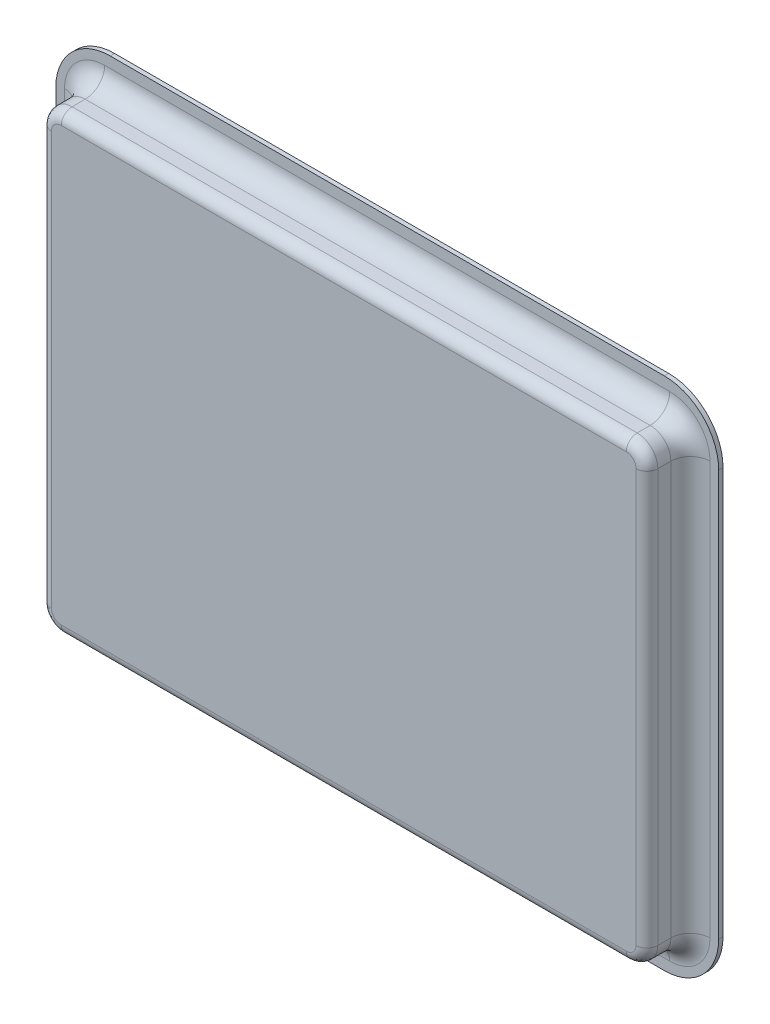
ISO-10303-21;
HEADER;
FILE_DESCRIPTION(('STEP AP214'),'2;1');
FILE_NAME('part.step','',(''),(''),'','','');
FILE_SCHEMA(('AUTOMOTIVE_DESIGN { 1 0 10303 214 1 1 1 1 }'));
ENDSEC;
DATA;
#1=APPLICATION_CONTEXT('core data for automotive mechanical design processes');
#2=APPLICATION_PROTOCOL_DEFINITION('international standard','automotive_design',2000,#1);
#3=PRODUCT_CONTEXT('',#1,'mechanical');
#4=PRODUCT('Part','Part','',(#3));
#5=PRODUCT_RELATED_PRODUCT_CATEGORY('part','',(#4));
#6=PRODUCT_DEFINITION_FORMATION('','',#4);
#7=PRODUCT_DEFINITION_CONTEXT('part definition',#1,'design');
#8=PRODUCT_DEFINITION('design','',#6,#7);
#9=PRODUCT_DEFINITION_SHAPE('','',#8);
#10=(LENGTH_UNIT() NAMED_UNIT(*) SI_UNIT(.MILLI.,.METRE.));
#11=(NAMED_UNIT(*) PLANE_ANGLE_UNIT() SI_UNIT($,.RADIAN.));
#12=(NAMED_UNIT(*) SI_UNIT($,.STERADIAN.) SOLID_ANGLE_UNIT());
#13=UNCERTAINTY_MEASURE_WITH_UNIT(LENGTH_MEASURE(1.E-05),#10,'distance_accuracy_value','');
#14=(GEOMETRIC_REPRESENTATION_CONTEXT(3) GLOBAL_UNCERTAINTY_ASSIGNED_CONTEXT((#13)) GLOBAL_UNIT_ASSIGNED_CONTEXT((#10,
#11,#12)) REPRESENTATION_CONTEXT('',''));
#15=CARTESIAN_POINT('',(0.,0.,0.));
#16=DIRECTION('',(0.,0.,1.));
#17=DIRECTION('',(1.,0.,0.));
#18=AXIS2_PLACEMENT_3D('',#15,#16,#17);
#19=CARTESIAN_POINT('',(0.,0.,0.));
#20=DIRECTION('',(0.,0.,1.));
#21=DIRECTION('',(1.,0.,0.));
#22=AXIS2_PLACEMENT_3D('',#19,#20,#21);
#23=PLANE('',#22);
#24=CARTESIAN_POINT('',(-1.275,0.935,0.));
#25=DIRECTION('',(0.,0.,1.));
#26=DIRECTION('',(1.,0.,0.));
#27=AXIS2_PLACEMENT_3D('',#24,#25,#26);
#28=CIRCLE('',#27,0.25);
#29=CARTESIAN_POINT('',(-1.275,1.185,0.));
#30=VERTEX_POINT('',#29);
#31=CARTESIAN_POINT('',(-1.525,0.935,0.));
#32=VERTEX_POINT('',#31);
#33=EDGE_CURVE('E223',#30,#32,#28,.T.);
#34=ORIENTED_EDGE('',*,*,#33,.F.);
#35=DIRECTION('',(1.,0.,0.));
#36=VECTOR('',#35,1.);
#37=CARTESIAN_POINT('',(-1.275,1.185,0.));
#38=LINE('',#37,#36);
#39=CARTESIAN_POINT('',(1.275,1.185,0.));
#40=VERTEX_POINT('',#39);
#41=EDGE_CURVE('E239',#30,#40,#38,.T.);
#42=ORIENTED_EDGE('',*,*,#41,.T.);
#43=CARTESIAN_POINT('',(1.275,0.935,0.));
#44=DIRECTION('',(0.,0.,1.));
#45=DIRECTION('',(1.,0.,0.));
#46=AXIS2_PLACEMENT_3D('',#43,#44,#45);
#47=CIRCLE('',#46,0.25);
#48=CARTESIAN_POINT('',(1.525,0.935,0.));
#49=VERTEX_POINT('',#48);
#50=EDGE_CURVE('E243',#49,#40,#47,.T.);
#51=ORIENTED_EDGE('',*,*,#50,.F.);
#52=DIRECTION('',(0.,-1.,0.));
#53=VECTOR('',#52,1.);
#54=CARTESIAN_POINT('',(1.525,0.935,0.));
#55=LINE('',#54,#53);
#56=CARTESIAN_POINT('',(1.525,-0.935,0.));
#57=VERTEX_POINT('',#56);
#58=EDGE_CURVE('E82',#49,#57,#55,.T.);
#59=ORIENTED_EDGE('',*,*,#58,.T.);
#60=CARTESIAN_POINT('',(1.275,-0.935,0.));
#61=DIRECTION('',(0.,0.,1.));
#62=DIRECTION('',(1.,0.,0.));
#63=AXIS2_PLACEMENT_3D('',#60,#61,#62);
#64=CIRCLE('',#63,0.25);
#65=CARTESIAN_POINT('',(1.275,-1.185,0.));
#66=VERTEX_POINT('',#65);
#67=EDGE_CURVE('E53',#66,#57,#64,.T.);
#68=ORIENTED_EDGE('',*,*,#67,.F.);
#69=DIRECTION('',(-1.,0.,0.));
#70=VECTOR('',#69,1.);
#71=CARTESIAN_POINT('',(1.275,-1.185,0.));
#72=LINE('',#71,#70);
#73=CARTESIAN_POINT('',(-1.275,-1.185,0.));
#74=VERTEX_POINT('',#73);
#75=EDGE_CURVE('E89',#66,#74,#72,.T.);
#76=ORIENTED_EDGE('',*,*,#75,.T.);
#77=CARTESIAN_POINT('',(-1.275,-0.935,0.));
#78=DIRECTION('',(0.,0.,1.));
#79=DIRECTION('',(1.,0.,0.));
#80=AXIS2_PLACEMENT_3D('',#77,#78,#79);
#81=CIRCLE('',#80,0.25);
#82=CARTESIAN_POINT('',(-1.525,-0.935,0.));
#83=VERTEX_POINT('',#82);
#84=EDGE_CURVE('E248',#83,#74,#81,.T.);
#85=ORIENTED_EDGE('',*,*,#84,.F.);
#86=DIRECTION('',(0.,1.,0.));
#87=VECTOR('',#86,1.);
#88=CARTESIAN_POINT('',(-1.525,-0.935,0.));
#89=LINE('',#88,#87);
#90=EDGE_CURVE('E238',#83,#32,#89,.T.);
#91=ORIENTED_EDGE('',*,*,#90,.T.);
#92=EDGE_LOOP('',(#34,#42,#51,#59,#68,#76,#85,#91));
#93=FACE_BOUND('',#92,.T.);
#94=ADVANCED_FACE('F17',(#93),#23,.F.);
#95=CARTESIAN_POINT('',(1.3,-0.95,0.02));
#96=DIRECTION('',(0.,0.,-1.));
#97=DIRECTION('',(1.,0.,0.));
#98=AXIS2_PLACEMENT_3D('',#95,#96,#97);
#99=CYLINDRICAL_SURFACE('',#98,0.095);
#100=DIRECTION('',(0.,0.,1.));
#101=VECTOR('',#100,1.);
#102=CARTESIAN_POINT('',(1.3,-1.045,0.02));
#103=LINE('',#102,#101);
#104=CARTESIAN_POINT('',(1.3,-1.045,0.11));
#105=VERTEX_POINT('',#104);
#106=CARTESIAN_POINT('',(1.3,-1.045,0.17));
#107=VERTEX_POINT('',#106);
#108=EDGE_CURVE('E11',#105,#107,#103,.T.);
#109=ORIENTED_EDGE('',*,*,#108,.F.);
#110=CARTESIAN_POINT('',(1.3,-0.95,0.11));
#111=DIRECTION('',(0.,0.,-1.));
#112=DIRECTION('',(1.,0.,0.));
#113=AXIS2_PLACEMENT_3D('',#110,#111,#112);
#114=CIRCLE('',#113,0.095);
#115=CARTESIAN_POINT('',(1.395,-0.95,0.11));
#116=VERTEX_POINT('',#115);
#117=EDGE_CURVE('E175',#116,#105,#114,.T.);
#118=ORIENTED_EDGE('',*,*,#117,.F.);
#119=DIRECTION('',(0.,0.,1.));
#120=VECTOR('',#119,1.);
#121=CARTESIAN_POINT('',(1.395,-0.95,0.02));
#122=LINE('',#121,#120);
#123=CARTESIAN_POINT('',(1.395,-0.95,0.17));
#124=VERTEX_POINT('',#123);
#125=EDGE_CURVE('E180',#116,#124,#122,.T.);
#126=ORIENTED_EDGE('',*,*,#125,.T.);
#127=CARTESIAN_POINT('',(1.3,-0.95,0.17));
#128=DIRECTION('',(0.,0.,1.));
#129=DIRECTION('',(0.,-1.,0.));
#130=AXIS2_PLACEMENT_3D('',#127,#128,#129);
#131=CIRCLE('',#130,0.095);
#132=EDGE_CURVE('E23',#107,#124,#131,.T.);
#133=ORIENTED_EDGE('',*,*,#132,.F.);
#134=EDGE_LOOP('',(#109,#118,#126,#133));
#135=FACE_BOUND('',#134,.T.);
#136=ADVANCED_FACE('F177',(#135),#99,.T.);
#137=CARTESIAN_POINT('',(1.3,-1.045,0.02));
#138=DIRECTION('',(0.,-1.,0.));
#139=DIRECTION('',(0.,0.,-1.));
#140=AXIS2_PLACEMENT_3D('',#137,#138,#139);
#141=PLANE('',#140);
#142=ORIENTED_EDGE('',*,*,#108,.T.);
#143=DIRECTION('',(1.,0.,0.));
#144=VECTOR('',#143,1.);
#145=CARTESIAN_POINT('',(-1.3,-1.045,0.17));
#146=LINE('',#145,#144);
#147=CARTESIAN_POINT('',(-1.3,-1.045,0.17));
#148=VERTEX_POINT('',#147);
#149=EDGE_CURVE('E29',#148,#107,#146,.T.);
#150=ORIENTED_EDGE('',*,*,#149,.F.);
#151=DIRECTION('',(0.,0.,1.));
#152=VECTOR('',#151,1.);
#153=CARTESIAN_POINT('',(-1.3,-1.045,0.02));
#154=LINE('',#153,#152);
#155=CARTESIAN_POINT('',(-1.3,-1.045,0.11));
#156=VERTEX_POINT('',#155);
#157=EDGE_CURVE('E352',#156,#148,#154,.T.);
#158=ORIENTED_EDGE('',*,*,#157,.F.);
#159=DIRECTION('',(-1.,0.,0.));
#160=VECTOR('',#159,1.);
#161=CARTESIAN_POINT('',(1.3,-1.045,0.11));
#162=LINE('',#161,#160);
#163=EDGE_CURVE('E196',#105,#156,#162,.T.);
#164=ORIENTED_EDGE('',*,*,#163,.F.);
#165=EDGE_LOOP('',(#142,#150,#158,#164));
#166=FACE_BOUND('',#165,.T.);
#167=ADVANCED_FACE('F502',(#166),#141,.T.);
#168=CARTESIAN_POINT('',(-1.3,-1.045,0.17));
#169=CARTESIAN_POINT('',(-1.395,-1.045,0.17));
#170=CARTESIAN_POINT('',(-1.395,-0.95,0.17));
#171=CARTESIAN_POINT('',(-1.3,-1.045,0.18308996939));
#172=CARTESIAN_POINT('',(-1.395,-1.045,0.18308996939));
#173=CARTESIAN_POINT('',(-1.395,-0.95,0.18308996939));
#174=CARTESIAN_POINT('',(-1.3,-1.040888615699,0.196178825035));
#175=CARTESIAN_POINT('',(-1.390888615699,-1.040888615699,0.196178825035));
#176=CARTESIAN_POINT('',(-1.390888615699,-0.95,0.196178825035));
#177=CARTESIAN_POINT('',(-1.3,-1.032659507482,0.207659507482));
#178=CARTESIAN_POINT('',(-1.382659507482,-1.032659507482,0.207659507482));
#179=CARTESIAN_POINT('',(-1.382659507482,-0.95,0.207659507482));
#180=CARTESIAN_POINT('',(-1.3,-1.021178825035,0.215888615699));
#181=CARTESIAN_POINT('',(-1.371178825035,-1.021178825035,0.215888615699));
#182=CARTESIAN_POINT('',(-1.371178825035,-0.95,0.215888615699));
#183=CARTESIAN_POINT('',(-1.3,-1.00808996939,0.22));
#184=CARTESIAN_POINT('',(-1.35808996939,-1.00808996939,0.22));
#185=CARTESIAN_POINT('',(-1.35808996939,-0.95,0.22));
#186=CARTESIAN_POINT('',(-1.3,-0.995,0.22));
#187=CARTESIAN_POINT('',(-1.345,-0.995,0.22));
#188=CARTESIAN_POINT('',(-1.345,-0.95,0.22));
#189=(BOUNDED_SURFACE() B_SPLINE_SURFACE(6,2,((#168,#169,#170),(#171,#172,#173),(#174,#175,
#176),(#177,#178,#179),(#180,#181,#182),(#183,#184,#185),(#186,#187,#188)),.UNSPECIFIED.,.F.,
.F.,.F.) B_SPLINE_SURFACE_WITH_KNOTS((7,7),(3,3),(0.,1.570796326795),(4.71238898038469,
6.28318530717959),.UNSPECIFIED.) GEOMETRIC_REPRESENTATION_ITEM() RATIONAL_B_SPLINE_SURFACE(((1.,
0.707106781186548,1.),(1.,0.707106781186548,1.),(1.,0.707106781186548,1.),(1.,0.707106781186548,
1.),(1.,0.707106781186548,1.),(1.,0.707106781186548,1.),(1.,0.707106781186548,1.))) REPRESENTATION_ITEM('') SURFACE());
#190=CARTESIAN_POINT('',(-1.345,-0.95,0.17));
#191=DIRECTION('',(0.,1.,0.));
#192=DIRECTION('',(-1.,0.,0.));
#193=AXIS2_PLACEMENT_3D('',#190,#191,#192);
#194=CIRCLE('',#193,0.05);
#195=CARTESIAN_POINT('',(-1.395,-0.95,0.17));
#196=VERTEX_POINT('',#195);
#197=CARTESIAN_POINT('',(-1.345,-0.95,0.22));
#198=VERTEX_POINT('',#197);
#199=EDGE_CURVE('E451',#196,#198,#194,.T.);
#200=CARTESIAN_POINT('',(-1.3,-0.95,0.17));
#201=DIRECTION('',(0.,0.,1.));
#202=DIRECTION('',(-1.,0.,0.));
#203=AXIS2_PLACEMENT_3D('',#200,#201,#202);
#204=CIRCLE('',#203,0.095);
#205=EDGE_CURVE('E348',#196,#148,#204,.T.);
#206=CARTESIAN_POINT('',(-1.3,-0.995,0.17));
#207=DIRECTION('',(-1.,0.,0.));
#208=DIRECTION('',(0.,-1.,0.));
#209=AXIS2_PLACEMENT_3D('',#206,#207,#208);
#210=CIRCLE('',#209,0.05);
#211=CARTESIAN_POINT('',(-1.3,-0.995,0.22));
#212=VERTEX_POINT('',#211);
#213=EDGE_CURVE('E378',#148,#212,#210,.T.);
#214=CARTESIAN_POINT('',(-1.3,-0.95,0.22));
#215=DIRECTION('',(0.,0.,1.));
#216=DIRECTION('',(-1.,0.,0.));
#217=AXIS2_PLACEMENT_3D('',#214,#215,#216);
#218=CIRCLE('',#217,0.045);
#219=EDGE_CURVE('E441',#198,#212,#218,.T.);
#220=ORIENTED_EDGE('',*,*,#199,.F.);
#221=ORIENTED_EDGE('',*,*,#205,.T.);
#222=ORIENTED_EDGE('',*,*,#213,.T.);
#223=ORIENTED_EDGE('',*,*,#219,.F.);
#224=EDGE_LOOP('',(#220,#221,#222,#223));
#225=FACE_BOUND('',#224,.T.);
#226=ADVANCED_FACE('F507',(#225),#189,.T.);
#227=CARTESIAN_POINT('',(1.345,-0.95,0.17));
#228=DIRECTION('',(0.,1.,0.));
#229=DIRECTION('',(1.,0.,0.));
#230=AXIS2_PLACEMENT_3D('',#227,#228,#229);
#231=CYLINDRICAL_SURFACE('',#230,0.05);
#232=CARTESIAN_POINT('',(1.345,-0.95,0.17));
#233=DIRECTION('',(0.,-1.,0.));
#234=DIRECTION('',(1.,0.,0.));
#235=AXIS2_PLACEMENT_3D('',#232,#233,#234);
#236=CIRCLE('',#235,0.05);
#237=CARTESIAN_POINT('',(1.345,-0.95,0.22));
#238=VERTEX_POINT('',#237);
#239=EDGE_CURVE('E168',#124,#238,#236,.T.);
#240=ORIENTED_EDGE('',*,*,#239,.F.);
#241=DIRECTION('',(0.,1.,0.));
#242=VECTOR('',#241,1.);
#243=CARTESIAN_POINT('',(1.395,-0.95,0.17));
#244=LINE('',#243,#242);
#245=CARTESIAN_POINT('',(1.395,0.95,0.17));
#246=VERTEX_POINT('',#245);
#247=EDGE_CURVE('E211',#124,#246,#244,.T.);
#248=ORIENTED_EDGE('',*,*,#247,.T.);
#249=CARTESIAN_POINT('',(1.345,0.95,0.17));
#250=DIRECTION('',(0.,-1.,0.));
#251=DIRECTION('',(1.,0.,0.));
#252=AXIS2_PLACEMENT_3D('',#249,#250,#251);
#253=CIRCLE('',#252,0.05);
#254=CARTESIAN_POINT('',(1.345,0.95,0.22));
#255=VERTEX_POINT('',#254);
#256=EDGE_CURVE('E217',#246,#255,#253,.T.);
#257=ORIENTED_EDGE('',*,*,#256,.T.);
#258=DIRECTION('',(0.,1.,0.));
#259=VECTOR('',#258,1.);
#260=CARTESIAN_POINT('',(1.345,-0.95,0.22));
#261=LINE('',#260,#259);
#262=EDGE_CURVE('E407',#238,#255,#261,.T.);
#263=ORIENTED_EDGE('',*,*,#262,.F.);
#264=EDGE_LOOP('',(#240,#248,#257,#263));
#265=FACE_BOUND('',#264,.T.);
#266=ADVANCED_FACE('F469',(#265),#231,.T.);
#267=CARTESIAN_POINT('',(-1.3,-0.995,0.17));
#268=DIRECTION('',(1.,0.,0.));
#269=DIRECTION('',(0.,-1.,0.));
#270=AXIS2_PLACEMENT_3D('',#267,#268,#269);
#271=CYLINDRICAL_SURFACE('',#270,0.05);
#272=ORIENTED_EDGE('',*,*,#213,.F.);
#273=ORIENTED_EDGE('',*,*,#149,.T.);
#274=CARTESIAN_POINT('',(1.3,-0.995,0.17));
#275=DIRECTION('',(-1.,0.,0.));
#276=DIRECTION('',(0.,-1.,0.));
#277=AXIS2_PLACEMENT_3D('',#274,#275,#276);
#278=CIRCLE('',#277,0.05);
#279=CARTESIAN_POINT('',(1.3,-0.995,0.22));
#280=VERTEX_POINT('',#279);
#281=EDGE_CURVE('E255',#107,#280,#278,.T.);
#282=ORIENTED_EDGE('',*,*,#281,.T.);
#283=DIRECTION('',(1.,0.,0.));
#284=VECTOR('',#283,1.);
#285=CARTESIAN_POINT('',(-1.3,-0.995,0.22));
#286=LINE('',#285,#284);
#287=EDGE_CURVE('E448',#212,#280,#286,.T.);
#288=ORIENTED_EDGE('',*,*,#287,.F.);
#289=EDGE_LOOP('',(#272,#273,#282,#288));
#290=FACE_BOUND('',#289,.T.);
#291=ADVANCED_FACE('F484',(#290),#271,.T.);
#292=CARTESIAN_POINT('',(1.395,-0.95,0.17));
#293=CARTESIAN_POINT('',(1.395,-1.045,0.17));
#294=CARTESIAN_POINT('',(1.3,-1.045,0.17));
#295=CARTESIAN_POINT('',(1.395,-0.95,0.18308996939));
#296=CARTESIAN_POINT('',(1.395,-1.045,0.18308996939));
#297=CARTESIAN_POINT('',(1.3,-1.045,0.18308996939));
#298=CARTESIAN_POINT('',(1.390888615699,-0.95,0.196178825035));
#299=CARTESIAN_POINT('',(1.390888615699,-1.040888615699,0.196178825035));
#300=CARTESIAN_POINT('',(1.3,-1.040888615699,0.196178825035));
#301=CARTESIAN_POINT('',(1.382659507482,-0.95,0.207659507482));
#302=CARTESIAN_POINT('',(1.382659507482,-1.032659507482,0.207659507482));
#303=CARTESIAN_POINT('',(1.3,-1.032659507482,0.207659507482));
#304=CARTESIAN_POINT('',(1.371178825035,-0.95,0.215888615699));
#305=CARTESIAN_POINT('',(1.371178825035,-1.021178825035,0.215888615699));
#306=CARTESIAN_POINT('',(1.3,-1.021178825035,0.215888615699));
#307=CARTESIAN_POINT('',(1.35808996939,-0.95,0.22));
#308=CARTESIAN_POINT('',(1.35808996939,-1.00808996939,0.22));
#309=CARTESIAN_POINT('',(1.3,-1.00808996939,0.22));
#310=CARTESIAN_POINT('',(1.345,-0.95,0.22));
#311=CARTESIAN_POINT('',(1.345,-0.995,0.22));
#312=CARTESIAN_POINT('',(1.3,-0.995,0.22));
#313=(BOUNDED_SURFACE() B_SPLINE_SURFACE(6,2,((#292,#293,#294),(#295,#296,#297),(#298,#299,
#300),(#301,#302,#303),(#304,#305,#306),(#307,#308,#309),(#310,#311,#312)),.UNSPECIFIED.,.F.,
.F.,.F.) B_SPLINE_SURFACE_WITH_KNOTS((7,7),(3,3),(0.,1.570796326795),(4.71238898038469,
6.28318530717959),.UNSPECIFIED.) GEOMETRIC_REPRESENTATION_ITEM() RATIONAL_B_SPLINE_SURFACE(((1.,
0.707106781186548,1.),(1.,0.707106781186548,1.),(1.,0.707106781186548,1.),(1.,0.707106781186548,
1.),(1.,0.707106781186548,1.),(1.,0.707106781186548,1.),(1.,0.707106781186548,1.))) REPRESENTATION_ITEM('') SURFACE());
#314=CARTESIAN_POINT('',(1.3,-0.95,0.22));
#315=DIRECTION('',(0.,0.,1.));
#316=DIRECTION('',(0.,-1.,0.));
#317=AXIS2_PLACEMENT_3D('',#314,#315,#316);
#318=CIRCLE('',#317,0.045);
#319=EDGE_CURVE('E403',#280,#238,#318,.T.);
#320=ORIENTED_EDGE('',*,*,#281,.F.);
#321=ORIENTED_EDGE('',*,*,#132,.T.);
#322=ORIENTED_EDGE('',*,*,#239,.T.);
#323=ORIENTED_EDGE('',*,*,#319,.F.);
#324=EDGE_LOOP('',(#320,#321,#322,#323));
#325=FACE_BOUND('',#324,.T.);
#326=ADVANCED_FACE('F481',(#325),#313,.T.);
#327=CARTESIAN_POINT('',(1.275,-0.935,0.));
#328=DIRECTION('',(0.,0.,-1.));
#329=DIRECTION('',(1.,0.,0.));
#330=AXIS2_PLACEMENT_3D('',#327,#328,#329);
#331=CYLINDRICAL_SURFACE('',#330,0.25);
#332=DIRECTION('',(0.,0.,1.));
#333=VECTOR('',#332,1.);
#334=CARTESIAN_POINT('',(1.275,-1.185,0.));
#335=LINE('',#334,#333);
#336=CARTESIAN_POINT('',(1.275,-1.185,0.02));
#337=VERTEX_POINT('',#336);
#338=EDGE_CURVE('E251',#66,#337,#335,.T.);
#339=ORIENTED_EDGE('',*,*,#338,.F.);
#340=ORIENTED_EDGE('',*,*,#67,.T.);
#341=DIRECTION('',(0.,0.,1.));
#342=VECTOR('',#341,1.);
#343=CARTESIAN_POINT('',(1.525,-0.935,0.));
#344=LINE('',#343,#342);
#345=CARTESIAN_POINT('',(1.525,-0.935,0.02));
#346=VERTEX_POINT('',#345);
#347=EDGE_CURVE('E247',#57,#346,#344,.T.);
#348=ORIENTED_EDGE('',*,*,#347,.T.);
#349=CARTESIAN_POINT('',(1.275,-0.935,0.02));
#350=DIRECTION('',(0.,0.,1.));
#351=DIRECTION('',(1.,0.,0.));
#352=AXIS2_PLACEMENT_3D('',#349,#350,#351);
#353=CIRCLE('',#352,0.25);
#354=EDGE_CURVE('E367',#337,#346,#353,.T.);
#355=ORIENTED_EDGE('',*,*,#354,.F.);
#356=EDGE_LOOP('',(#339,#340,#348,#355));
#357=FACE_BOUND('',#356,.T.);
#358=ADVANCED_FACE('F483',(#357),#331,.T.);
#359=CARTESIAN_POINT('',(1.275,-1.185,0.));
#360=DIRECTION('',(0.,-1.,0.));
#361=DIRECTION('',(0.,0.,-1.));
#362=AXIS2_PLACEMENT_3D('',#359,#360,#361);
#363=PLANE('',#362);
#364=ORIENTED_EDGE('',*,*,#338,.T.);
#365=DIRECTION('',(-1.,0.,0.));
#366=VECTOR('',#365,1.);
#367=CARTESIAN_POINT('',(1.275,-1.185,0.02));
#368=LINE('',#367,#366);
#369=CARTESIAN_POINT('',(-1.275,-1.185,0.02));
#370=VERTEX_POINT('',#369);
#371=EDGE_CURVE('E396',#337,#370,#368,.T.);
#372=ORIENTED_EDGE('',*,*,#371,.T.);
#373=DIRECTION('',(0.,0.,1.));
#374=VECTOR('',#373,1.);
#375=CARTESIAN_POINT('',(-1.275,-1.185,0.));
#376=LINE('',#375,#374);
#377=EDGE_CURVE('E244',#74,#370,#376,.T.);
#378=ORIENTED_EDGE('',*,*,#377,.F.);
#379=ORIENTED_EDGE('',*,*,#75,.F.);
#380=EDGE_LOOP('',(#364,#372,#378,#379));
#381=FACE_BOUND('',#380,.T.);
#382=ADVANCED_FACE('F491',(#381),#363,.T.);
#383=CARTESIAN_POINT('',(1.525,0.935,0.));
#384=DIRECTION('',(1.,0.,0.));
#385=DIRECTION('',(0.,1.,0.));
#386=AXIS2_PLACEMENT_3D('',#383,#384,#385);
#387=PLANE('',#386);
#388=DIRECTION('',(0.,0.,1.));
#389=VECTOR('',#388,1.);
#390=CARTESIAN_POINT('',(1.525,0.935,0.));
#391=LINE('',#390,#389);
#392=CARTESIAN_POINT('',(1.525,0.935,0.02));
#393=VERTEX_POINT('',#392);
#394=EDGE_CURVE('E240',#49,#393,#391,.T.);
#395=ORIENTED_EDGE('',*,*,#394,.T.);
#396=DIRECTION('',(0.,-1.,0.));
#397=VECTOR('',#396,1.);
#398=CARTESIAN_POINT('',(1.525,0.935,0.02));
#399=LINE('',#398,#397);
#400=EDGE_CURVE('E362',#393,#346,#399,.T.);
#401=ORIENTED_EDGE('',*,*,#400,.T.);
#402=ORIENTED_EDGE('',*,*,#347,.F.);
#403=ORIENTED_EDGE('',*,*,#58,.F.);
#404=EDGE_LOOP('',(#395,#401,#402,#403));
#405=FACE_BOUND('',#404,.T.);
#406=ADVANCED_FACE('F710',(#405),#387,.T.);
#407=CARTESIAN_POINT('',(-1.275,-0.935,0.));
#408=DIRECTION('',(0.,0.,-1.));
#409=DIRECTION('',(1.,0.,0.));
#410=AXIS2_PLACEMENT_3D('',#407,#408,#409);
#411=CYLINDRICAL_SURFACE('',#410,0.25);
#412=DIRECTION('',(0.,0.,1.));
#413=VECTOR('',#412,1.);
#414=CARTESIAN_POINT('',(-1.525,-0.935,0.));
#415=LINE('',#414,#413);
#416=CARTESIAN_POINT('',(-1.525,-0.935,0.02));
#417=VERTEX_POINT('',#416);
#418=EDGE_CURVE('E235',#83,#417,#415,.T.);
#419=ORIENTED_EDGE('',*,*,#418,.F.);
#420=ORIENTED_EDGE('',*,*,#84,.T.);
#421=ORIENTED_EDGE('',*,*,#377,.T.);
#422=CARTESIAN_POINT('',(-1.275,-0.935,0.02));
#423=DIRECTION('',(0.,0.,1.));
#424=DIRECTION('',(1.,0.,0.));
#425=AXIS2_PLACEMENT_3D('',#422,#423,#424);
#426=CIRCLE('',#425,0.25);
#427=EDGE_CURVE('E392',#417,#370,#426,.T.);
#428=ORIENTED_EDGE('',*,*,#427,.F.);
#429=EDGE_LOOP('',(#419,#420,#421,#428));
#430=FACE_BOUND('',#429,.T.);
#431=ADVANCED_FACE('F706',(#430),#411,.T.);
#432=CARTESIAN_POINT('',(1.275,0.935,0.));
#433=DIRECTION('',(0.,0.,-1.));
#434=DIRECTION('',(1.,0.,0.));
#435=AXIS2_PLACEMENT_3D('',#432,#433,#434);
#436=CYLINDRICAL_SURFACE('',#435,0.25);
#437=ORIENTED_EDGE('',*,*,#394,.F.);
#438=ORIENTED_EDGE('',*,*,#50,.T.);
#439=DIRECTION('',(0.,0.,1.));
#440=VECTOR('',#439,1.);
#441=CARTESIAN_POINT('',(1.275,1.185,0.));
#442=LINE('',#441,#440);
#443=CARTESIAN_POINT('',(1.275,1.185,0.02));
#444=VERTEX_POINT('',#443);
#445=EDGE_CURVE('E222',#40,#444,#442,.T.);
#446=ORIENTED_EDGE('',*,*,#445,.T.);
#447=CARTESIAN_POINT('',(1.275,0.935,0.02));
#448=DIRECTION('',(0.,0.,1.));
#449=DIRECTION('',(1.,0.,0.));
#450=AXIS2_PLACEMENT_3D('',#447,#448,#449);
#451=CIRCLE('',#450,0.25);
#452=EDGE_CURVE('E366',#393,#444,#451,.T.);
#453=ORIENTED_EDGE('',*,*,#452,.F.);
#454=EDGE_LOOP('',(#437,#438,#446,#453));
#455=FACE_BOUND('',#454,.T.);
#456=ADVANCED_FACE('F702',(#455),#436,.T.);
#457=CARTESIAN_POINT('',(-1.525,-0.935,0.));
#458=DIRECTION('',(-1.,0.,0.));
#459=DIRECTION('',(0.,0.,1.));
#460=AXIS2_PLACEMENT_3D('',#457,#458,#459);
#461=PLANE('',#460);
#462=ORIENTED_EDGE('',*,*,#418,.T.);
#463=DIRECTION('',(0.,1.,0.));
#464=VECTOR('',#463,1.);
#465=CARTESIAN_POINT('',(-1.525,-0.935,0.02));
#466=LINE('',#465,#464);
#467=CARTESIAN_POINT('',(-1.525,0.935,0.02));
#468=VERTEX_POINT('',#467);
#469=EDGE_CURVE('E386',#417,#468,#466,.T.);
#470=ORIENTED_EDGE('',*,*,#469,.T.);
#471=DIRECTION('',(0.,0.,1.));
#472=VECTOR('',#471,1.);
#473=CARTESIAN_POINT('',(-1.525,0.935,0.));
#474=LINE('',#473,#472);
#475=EDGE_CURVE('E221',#32,#468,#474,.T.);
#476=ORIENTED_EDGE('',*,*,#475,.F.);
#477=ORIENTED_EDGE('',*,*,#90,.F.);
#478=EDGE_LOOP('',(#462,#470,#476,#477));
#479=FACE_BOUND('',#478,.T.);
#480=ADVANCED_FACE('F698',(#479),#461,.T.);
#481=CARTESIAN_POINT('',(-1.275,1.185,0.));
#482=DIRECTION('',(0.,1.,0.));
#483=DIRECTION('',(1.,0.,0.));
#484=AXIS2_PLACEMENT_3D('',#481,#482,#483);
#485=PLANE('',#484);
#486=DIRECTION('',(0.,0.,1.));
#487=VECTOR('',#486,1.);
#488=CARTESIAN_POINT('',(-1.275,1.185,0.));
#489=LINE('',#488,#487);
#490=CARTESIAN_POINT('',(-1.275,1.185,0.02));
#491=VERTEX_POINT('',#490);
#492=EDGE_CURVE('E184',#30,#491,#489,.T.);
#493=ORIENTED_EDGE('',*,*,#492,.T.);
#494=DIRECTION('',(1.,0.,0.));
#495=VECTOR('',#494,1.);
#496=CARTESIAN_POINT('',(-1.275,1.185,0.02));
#497=LINE('',#496,#495);
#498=EDGE_CURVE('E416',#491,#444,#497,.T.);
#499=ORIENTED_EDGE('',*,*,#498,.T.);
#500=ORIENTED_EDGE('',*,*,#445,.F.);
#501=ORIENTED_EDGE('',*,*,#41,.F.);
#502=EDGE_LOOP('',(#493,#499,#500,#501));
#503=FACE_BOUND('',#502,.T.);
#504=ADVANCED_FACE('F694',(#503),#485,.T.);
#505=CARTESIAN_POINT('',(-1.275,0.935,0.));
#506=DIRECTION('',(0.,0.,-1.));
#507=DIRECTION('',(1.,0.,0.));
#508=AXIS2_PLACEMENT_3D('',#505,#506,#507);
#509=CYLINDRICAL_SURFACE('',#508,0.25);
#510=ORIENTED_EDGE('',*,*,#492,.F.);
#511=ORIENTED_EDGE('',*,*,#33,.T.);
#512=ORIENTED_EDGE('',*,*,#475,.T.);
#513=CARTESIAN_POINT('',(-1.275,0.935,0.02));
#514=DIRECTION('',(0.,0.,1.));
#515=DIRECTION('',(1.,0.,0.));
#516=AXIS2_PLACEMENT_3D('',#513,#514,#515);
#517=CIRCLE('',#516,0.25);
#518=EDGE_CURVE('E382',#491,#468,#517,.T.);
#519=ORIENTED_EDGE('',*,*,#518,.F.);
#520=EDGE_LOOP('',(#510,#511,#512,#519));
#521=FACE_BOUND('',#520,.T.);
#522=ADVANCED_FACE('F691',(#521),#509,.T.);
#523=CARTESIAN_POINT('',(1.485,0.95,0.11));
#524=DIRECTION('',(0.,-1.,0.));
#525=DIRECTION('',(0.,0.,-1.));
#526=AXIS2_PLACEMENT_3D('',#523,#524,#525);
#527=CYLINDRICAL_SURFACE('',#526,0.09);
#528=CARTESIAN_POINT('',(1.485,0.95,0.11));
#529=DIRECTION('',(0.,1.,0.));
#530=DIRECTION('',(1.,0.,0.));
#531=AXIS2_PLACEMENT_3D('',#528,#529,#530);
#532=CIRCLE('',#531,0.09);
#533=CARTESIAN_POINT('',(1.485,0.95,0.02));
#534=VERTEX_POINT('',#533);
#535=CARTESIAN_POINT('',(1.395,0.95,0.11));
#536=VERTEX_POINT('',#535);
#537=EDGE_CURVE('E203',#534,#536,#532,.T.);
#538=ORIENTED_EDGE('',*,*,#537,.T.);
#539=DIRECTION('',(0.,-1.,0.));
#540=VECTOR('',#539,1.);
#541=CARTESIAN_POINT('',(1.395,0.95,0.11));
#542=LINE('',#541,#540);
#543=EDGE_CURVE('E200',#536,#116,#542,.T.);
#544=ORIENTED_EDGE('',*,*,#543,.T.);
#545=CARTESIAN_POINT('',(1.485,-0.95,0.11));
#546=DIRECTION('',(0.,1.,0.));
#547=DIRECTION('',(0.,0.,-1.));
#548=AXIS2_PLACEMENT_3D('',#545,#546,#547);
#549=CIRCLE('',#548,0.09);
#550=CARTESIAN_POINT('',(1.485,-0.95,0.02));
#551=VERTEX_POINT('',#550);
#552=EDGE_CURVE('E185',#551,#116,#549,.T.);
#553=ORIENTED_EDGE('',*,*,#552,.F.);
#554=DIRECTION('',(0.,-1.,0.));
#555=VECTOR('',#554,1.);
#556=CARTESIAN_POINT('',(1.485,0.95,0.02));
#557=LINE('',#556,#555);
#558=EDGE_CURVE('E290',#534,#551,#557,.T.);
#559=ORIENTED_EDGE('',*,*,#558,.F.);
#560=EDGE_LOOP('',(#538,#544,#553,#559));
#561=FACE_BOUND('',#560,.T.);
#562=ADVANCED_FACE('F201',(#561),#527,.F.);
#563=CARTESIAN_POINT('',(1.3,-0.95,0.11));
#564=DIRECTION('',(0.,0.,-1.));
#565=DIRECTION('',(1.,0.,0.));
#566=AXIS2_PLACEMENT_3D('',#563,#564,#565);
#567=TOROIDAL_SURFACE('',#566,0.185,0.09);
#568=ORIENTED_EDGE('',*,*,#552,.T.);
#569=ORIENTED_EDGE('',*,*,#117,.T.);
#570=CARTESIAN_POINT('',(1.3,-1.135,0.11));
#571=DIRECTION('',(1.,0.,0.));
#572=DIRECTION('',(0.,0.,-1.));
#573=AXIS2_PLACEMENT_3D('',#570,#571,#572);
#574=CIRCLE('',#573,0.09);
#575=CARTESIAN_POINT('',(1.3,-1.135,0.02));
#576=VERTEX_POINT('',#575);
#577=EDGE_CURVE('E228',#576,#105,#574,.T.);
#578=ORIENTED_EDGE('',*,*,#577,.F.);
#579=CARTESIAN_POINT('',(1.3,-0.95,0.02));
#580=DIRECTION('',(0.,0.,-1.));
#581=DIRECTION('',(1.,0.,0.));
#582=AXIS2_PLACEMENT_3D('',#579,#580,#581);
#583=CIRCLE('',#582,0.185);
#584=EDGE_CURVE('E191',#551,#576,#583,.T.);
#585=ORIENTED_EDGE('',*,*,#584,.F.);
#586=EDGE_LOOP('',(#568,#569,#578,#585));
#587=FACE_BOUND('',#586,.T.);
#588=ADVANCED_FACE('F189',(#587),#567,.F.);
#589=CARTESIAN_POINT('',(1.3,-1.135,0.11));
#590=DIRECTION('',(-1.,0.,0.));
#591=DIRECTION('',(0.,0.,-1.));
#592=AXIS2_PLACEMENT_3D('',#589,#590,#591);
#593=CYLINDRICAL_SURFACE('',#592,0.09);
#594=ORIENTED_EDGE('',*,*,#577,.T.);
#595=ORIENTED_EDGE('',*,*,#163,.T.);
#596=CARTESIAN_POINT('',(-1.3,-1.135,0.11));
#597=DIRECTION('',(1.,0.,0.));
#598=DIRECTION('',(0.,0.,-1.));
#599=AXIS2_PLACEMENT_3D('',#596,#597,#598);
#600=CIRCLE('',#599,0.09);
#601=CARTESIAN_POINT('',(-1.3,-1.135,0.02));
#602=VERTEX_POINT('',#601);
#603=EDGE_CURVE('E208',#602,#156,#600,.T.);
#604=ORIENTED_EDGE('',*,*,#603,.F.);
#605=DIRECTION('',(-1.,0.,0.));
#606=VECTOR('',#605,1.);
#607=CARTESIAN_POINT('',(1.3,-1.135,0.02));
#608=LINE('',#607,#606);
#609=EDGE_CURVE('E280',#576,#602,#608,.T.);
#610=ORIENTED_EDGE('',*,*,#609,.F.);
#611=EDGE_LOOP('',(#594,#595,#604,#610));
#612=FACE_BOUND('',#611,.T.);
#613=ADVANCED_FACE('F684',(#612),#593,.F.);
#614=CARTESIAN_POINT('',(-1.3,-0.95,0.11));
#615=DIRECTION('',(0.,0.,-1.));
#616=DIRECTION('',(0.,-1.,0.));
#617=AXIS2_PLACEMENT_3D('',#614,#615,#616);
#618=TOROIDAL_SURFACE('',#617,0.185,0.09);
#619=ORIENTED_EDGE('',*,*,#603,.T.);
#620=CARTESIAN_POINT('',(-1.3,-0.95,0.11));
#621=DIRECTION('',(0.,0.,-1.));
#622=DIRECTION('',(0.,-1.,0.));
#623=AXIS2_PLACEMENT_3D('',#620,#621,#622);
#624=CIRCLE('',#623,0.095);
#625=CARTESIAN_POINT('',(-1.395,-0.95,0.11));
#626=VERTEX_POINT('',#625);
#627=EDGE_CURVE('E455',#156,#626,#624,.T.);
#628=ORIENTED_EDGE('',*,*,#627,.T.);
#629=CARTESIAN_POINT('',(-1.485,-0.95,0.11));
#630=DIRECTION('',(0.,-1.,0.));
#631=DIRECTION('',(-1.,0.,0.));
#632=AXIS2_PLACEMENT_3D('',#629,#630,#631);
#633=CIRCLE('',#632,0.09);
#634=CARTESIAN_POINT('',(-1.485,-0.95,0.02));
#635=VERTEX_POINT('',#634);
#636=EDGE_CURVE('E371',#635,#626,#633,.T.);
#637=ORIENTED_EDGE('',*,*,#636,.F.);
#638=CARTESIAN_POINT('',(-1.3,-0.95,0.02));
#639=DIRECTION('',(0.,0.,-1.));
#640=DIRECTION('',(0.,-1.,0.));
#641=AXIS2_PLACEMENT_3D('',#638,#639,#640);
#642=CIRCLE('',#641,0.185);
#643=EDGE_CURVE('E275',#602,#635,#642,.T.);
#644=ORIENTED_EDGE('',*,*,#643,.F.);
#645=EDGE_LOOP('',(#619,#628,#637,#644));
#646=FACE_BOUND('',#645,.T.);
#647=ADVANCED_FACE('F646',(#646),#618,.F.);
#648=CARTESIAN_POINT('',(1.395,0.95,0.02));
#649=DIRECTION('',(1.,0.,0.));
#650=DIRECTION('',(0.,1.,0.));
#651=AXIS2_PLACEMENT_3D('',#648,#649,#650);
#652=PLANE('',#651);
#653=DIRECTION('',(0.,0.,1.));
#654=VECTOR('',#653,1.);
#655=CARTESIAN_POINT('',(1.395,0.95,0.02));
#656=LINE('',#655,#654);
#657=EDGE_CURVE('E307',#536,#246,#656,.T.);
#658=ORIENTED_EDGE('',*,*,#657,.T.);
#659=ORIENTED_EDGE('',*,*,#247,.F.);
#660=ORIENTED_EDGE('',*,*,#125,.F.);
#661=ORIENTED_EDGE('',*,*,#543,.F.);
#662=EDGE_LOOP('',(#658,#659,#660,#661));
#663=FACE_BOUND('',#662,.T.);
#664=ADVANCED_FACE('F210',(#663),#652,.T.);
#665=CARTESIAN_POINT('',(1.3,1.045,0.17));
#666=CARTESIAN_POINT('',(1.395,1.045,0.17));
#667=CARTESIAN_POINT('',(1.395,0.95,0.17));
#668=CARTESIAN_POINT('',(1.3,1.045,0.18308996939));
#669=CARTESIAN_POINT('',(1.395,1.045,0.18308996939));
#670=CARTESIAN_POINT('',(1.395,0.95,0.18308996939));
#671=CARTESIAN_POINT('',(1.3,1.040888615699,0.196178825035));
#672=CARTESIAN_POINT('',(1.390888615699,1.040888615699,0.196178825035));
#673=CARTESIAN_POINT('',(1.390888615699,0.95,0.196178825035));
#674=CARTESIAN_POINT('',(1.3,1.032659507482,0.207659507482));
#675=CARTESIAN_POINT('',(1.382659507482,1.032659507482,0.207659507482));
#676=CARTESIAN_POINT('',(1.382659507482,0.95,0.207659507482));
#677=CARTESIAN_POINT('',(1.3,1.021178825035,0.215888615699));
#678=CARTESIAN_POINT('',(1.371178825035,1.021178825035,0.215888615699));
#679=CARTESIAN_POINT('',(1.371178825035,0.95,0.215888615699));
#680=CARTESIAN_POINT('',(1.3,1.00808996939,0.22));
#681=CARTESIAN_POINT('',(1.35808996939,1.00808996939,0.22));
#682=CARTESIAN_POINT('',(1.35808996939,0.95,0.22));
#683=CARTESIAN_POINT('',(1.3,0.995,0.22));
#684=CARTESIAN_POINT('',(1.345,0.995,0.22));
#685=CARTESIAN_POINT('',(1.345,0.95,0.22));
#686=(BOUNDED_SURFACE() B_SPLINE_SURFACE(6,2,((#665,#666,#667),(#668,#669,#670),(#671,#672,
#673),(#674,#675,#676),(#677,#678,#679),(#680,#681,#682),(#683,#684,#685)),.UNSPECIFIED.,.F.,
.F.,.F.) B_SPLINE_SURFACE_WITH_KNOTS((7,7),(3,3),(0.,1.570796326795),(4.71238898038469,
6.28318530717959),.UNSPECIFIED.) GEOMETRIC_REPRESENTATION_ITEM() RATIONAL_B_SPLINE_SURFACE(((1.,
0.707106781186548,1.),(1.,0.707106781186548,1.),(1.,0.707106781186548,1.),(1.,0.707106781186548,
1.),(1.,0.707106781186548,1.),(1.,0.707106781186548,1.),(1.,0.707106781186548,1.))) REPRESENTATION_ITEM('') SURFACE());
#687=CARTESIAN_POINT('',(1.3,0.95,0.17));
#688=DIRECTION('',(0.,0.,1.));
#689=DIRECTION('',(1.,0.,0.));
#690=AXIS2_PLACEMENT_3D('',#687,#688,#689);
#691=CIRCLE('',#690,0.095);
#692=CARTESIAN_POINT('',(1.3,1.045,0.17));
#693=VERTEX_POINT('',#692);
#694=EDGE_CURVE('E361',#246,#693,#691,.T.);
#695=CARTESIAN_POINT('',(1.3,0.995,0.17));
#696=DIRECTION('',(1.,0.,0.));
#697=DIRECTION('',(0.,1.,0.));
#698=AXIS2_PLACEMENT_3D('',#695,#696,#697);
#699=CIRCLE('',#698,0.05);
#700=CARTESIAN_POINT('',(1.3,0.995,0.22));
#701=VERTEX_POINT('',#700);
#702=EDGE_CURVE('E308',#693,#701,#699,.T.);
#703=CARTESIAN_POINT('',(1.3,0.95,0.22));
#704=DIRECTION('',(0.,0.,1.));
#705=DIRECTION('',(1.,0.,0.));
#706=AXIS2_PLACEMENT_3D('',#703,#704,#705);
#707=CIRCLE('',#706,0.045);
#708=EDGE_CURVE('E427',#255,#701,#707,.T.);
#709=ORIENTED_EDGE('',*,*,#256,.F.);
#710=ORIENTED_EDGE('',*,*,#694,.T.);
#711=ORIENTED_EDGE('',*,*,#702,.T.);
#712=ORIENTED_EDGE('',*,*,#708,.F.);
#713=EDGE_LOOP('',(#709,#710,#711,#712));
#714=FACE_BOUND('',#713,.T.);
#715=ADVANCED_FACE('F473',(#714),#686,.T.);
#716=CARTESIAN_POINT('',(1.3,0.95,0.11));
#717=DIRECTION('',(0.,0.,-1.));
#718=DIRECTION('',(0.,1.,0.));
#719=AXIS2_PLACEMENT_3D('',#716,#717,#718);
#720=TOROIDAL_SURFACE('',#719,0.185,0.09);
#721=CARTESIAN_POINT('',(1.3,1.135,0.11));
#722=DIRECTION('',(-1.,0.,0.));
#723=DIRECTION('',(0.,0.,-1.));
#724=AXIS2_PLACEMENT_3D('',#721,#722,#723);
#725=CIRCLE('',#724,0.09);
#726=CARTESIAN_POINT('',(1.3,1.135,0.02));
#727=VERTEX_POINT('',#726);
#728=CARTESIAN_POINT('',(1.3,1.045,0.11));
#729=VERTEX_POINT('',#728);
#730=EDGE_CURVE('E337',#727,#729,#725,.T.);
#731=ORIENTED_EDGE('',*,*,#730,.T.);
#732=CARTESIAN_POINT('',(1.3,0.95,0.11));
#733=DIRECTION('',(0.,0.,-1.));
#734=DIRECTION('',(0.,1.,0.));
#735=AXIS2_PLACEMENT_3D('',#732,#733,#734);
#736=CIRCLE('',#735,0.095);
#737=EDGE_CURVE('E358',#729,#536,#736,.T.);
#738=ORIENTED_EDGE('',*,*,#737,.T.);
#739=ORIENTED_EDGE('',*,*,#537,.F.);
#740=CARTESIAN_POINT('',(1.3,0.95,0.02));
#741=DIRECTION('',(0.,0.,-1.));
#742=DIRECTION('',(0.,1.,0.));
#743=AXIS2_PLACEMENT_3D('',#740,#741,#742);
#744=CIRCLE('',#743,0.185);
#745=EDGE_CURVE('E279',#727,#534,#744,.T.);
#746=ORIENTED_EDGE('',*,*,#745,.F.);
#747=EDGE_LOOP('',(#731,#738,#739,#746));
#748=FACE_BOUND('',#747,.T.);
#749=ADVANCED_FACE('F678',(#748),#720,.F.);
#750=CARTESIAN_POINT('',(-1.3,-0.95,0.02));
#751=DIRECTION('',(0.,0.,-1.));
#752=DIRECTION('',(1.,0.,0.));
#753=AXIS2_PLACEMENT_3D('',#750,#751,#752);
#754=CYLINDRICAL_SURFACE('',#753,0.095);
#755=DIRECTION('',(0.,0.,1.));
#756=VECTOR('',#755,1.);
#757=CARTESIAN_POINT('',(-1.395,-0.95,0.02));
#758=LINE('',#757,#756);
#759=EDGE_CURVE('E317',#626,#196,#758,.T.);
#760=ORIENTED_EDGE('',*,*,#759,.F.);
#761=ORIENTED_EDGE('',*,*,#627,.F.);
#762=ORIENTED_EDGE('',*,*,#157,.T.);
#763=ORIENTED_EDGE('',*,*,#205,.F.);
#764=EDGE_LOOP('',(#760,#761,#762,#763));
#765=FACE_BOUND('',#764,.T.);
#766=ADVANCED_FACE('F547',(#765),#754,.T.);
#767=CARTESIAN_POINT('',(-1.345,0.95,0.17));
#768=DIRECTION('',(0.,-1.,0.));
#769=DIRECTION('',(-1.,0.,0.));
#770=AXIS2_PLACEMENT_3D('',#767,#768,#769);
#771=CYLINDRICAL_SURFACE('',#770,0.05);
#772=CARTESIAN_POINT('',(-1.345,0.95,0.17));
#773=DIRECTION('',(0.,1.,0.));
#774=DIRECTION('',(-1.,0.,0.));
#775=AXIS2_PLACEMENT_3D('',#772,#773,#774);
#776=CIRCLE('',#775,0.05);
#777=CARTESIAN_POINT('',(-1.395,0.95,0.17));
#778=VERTEX_POINT('',#777);
#779=CARTESIAN_POINT('',(-1.345,0.95,0.22));
#780=VERTEX_POINT('',#779);
#781=EDGE_CURVE('E272',#778,#780,#776,.T.);
#782=ORIENTED_EDGE('',*,*,#781,.F.);
#783=DIRECTION('',(0.,-1.,0.));
#784=VECTOR('',#783,1.);
#785=CARTESIAN_POINT('',(-1.395,0.95,0.17));
#786=LINE('',#785,#784);
#787=EDGE_CURVE('E336',#778,#196,#786,.T.);
#788=ORIENTED_EDGE('',*,*,#787,.T.);
#789=ORIENTED_EDGE('',*,*,#199,.T.);
#790=DIRECTION('',(0.,-1.,0.));
#791=VECTOR('',#790,1.);
#792=CARTESIAN_POINT('',(-1.345,0.95,0.22));
#793=LINE('',#792,#791);
#794=EDGE_CURVE('E437',#780,#198,#793,.T.);
#795=ORIENTED_EDGE('',*,*,#794,.F.);
#796=EDGE_LOOP('',(#782,#788,#789,#795));
#797=FACE_BOUND('',#796,.T.);
#798=ADVANCED_FACE('F534',(#797),#771,.T.);
#799=CARTESIAN_POINT('',(0.,0.,0.22));
#800=DIRECTION('',(0.,0.,1.));
#801=DIRECTION('',(1.,0.,0.));
#802=AXIS2_PLACEMENT_3D('',#799,#800,#801);
#803=PLANE('',#802);
#804=ORIENTED_EDGE('',*,*,#319,.T.);
#805=ORIENTED_EDGE('',*,*,#262,.T.);
#806=ORIENTED_EDGE('',*,*,#708,.T.);
#807=DIRECTION('',(-1.,0.,0.));
#808=VECTOR('',#807,1.);
#809=CARTESIAN_POINT('',(1.3,0.995,0.22));
#810=LINE('',#809,#808);
#811=CARTESIAN_POINT('',(-1.3,0.995,0.22));
#812=VERTEX_POINT('',#811);
#813=EDGE_CURVE('E303',#701,#812,#810,.T.);
#814=ORIENTED_EDGE('',*,*,#813,.T.);
#815=CARTESIAN_POINT('',(-1.3,0.95,0.22));
#816=DIRECTION('',(0.,0.,1.));
#817=DIRECTION('',(0.,1.,0.));
#818=AXIS2_PLACEMENT_3D('',#815,#816,#817);
#819=CIRCLE('',#818,0.045);
#820=EDGE_CURVE('E313',#812,#780,#819,.T.);
#821=ORIENTED_EDGE('',*,*,#820,.T.);
#822=ORIENTED_EDGE('',*,*,#794,.T.);
#823=ORIENTED_EDGE('',*,*,#219,.T.);
#824=ORIENTED_EDGE('',*,*,#287,.T.);
#825=EDGE_LOOP('',(#804,#805,#806,#814,#821,#822,#823,#824));
#826=FACE_BOUND('',#825,.T.);
#827=ADVANCED_FACE('F478',(#826),#803,.T.);
#828=CARTESIAN_POINT('',(0.,0.,0.02));
#829=DIRECTION('',(0.,0.,1.));
#830=DIRECTION('',(1.,0.,0.));
#831=AXIS2_PLACEMENT_3D('',#828,#829,#830);
#832=PLANE('',#831);
#833=ORIENTED_EDGE('',*,*,#609,.T.);
#834=ORIENTED_EDGE('',*,*,#643,.T.);
#835=DIRECTION('',(0.,1.,0.));
#836=VECTOR('',#835,1.);
#837=CARTESIAN_POINT('',(-1.485,-0.95,0.02));
#838=LINE('',#837,#836);
#839=CARTESIAN_POINT('',(-1.485,0.95,0.02));
#840=VERTEX_POINT('',#839);
#841=EDGE_CURVE('E375',#635,#840,#838,.T.);
#842=ORIENTED_EDGE('',*,*,#841,.T.);
#843=CARTESIAN_POINT('',(-1.3,0.95,0.02));
#844=DIRECTION('',(0.,0.,-1.));
#845=DIRECTION('',(-1.,0.,0.));
#846=AXIS2_PLACEMENT_3D('',#843,#844,#845);
#847=CIRCLE('',#846,0.185);
#848=CARTESIAN_POINT('',(-1.3,1.135,0.02));
#849=VERTEX_POINT('',#848);
#850=EDGE_CURVE('E323',#840,#849,#847,.T.);
#851=ORIENTED_EDGE('',*,*,#850,.T.);
#852=DIRECTION('',(1.,0.,0.));
#853=VECTOR('',#852,1.);
#854=CARTESIAN_POINT('',(-1.3,1.135,0.02));
#855=LINE('',#854,#853);
#856=EDGE_CURVE('E341',#849,#727,#855,.T.);
#857=ORIENTED_EDGE('',*,*,#856,.T.);
#858=ORIENTED_EDGE('',*,*,#745,.T.);
#859=ORIENTED_EDGE('',*,*,#558,.T.);
#860=ORIENTED_EDGE('',*,*,#584,.T.);
#861=EDGE_LOOP('',(#833,#834,#842,#851,#857,#858,#859,#860));
#862=FACE_BOUND('',#861,.T.);
#863=ORIENTED_EDGE('',*,*,#518,.T.);
#864=ORIENTED_EDGE('',*,*,#469,.F.);
#865=ORIENTED_EDGE('',*,*,#427,.T.);
#866=ORIENTED_EDGE('',*,*,#371,.F.);
#867=ORIENTED_EDGE('',*,*,#354,.T.);
#868=ORIENTED_EDGE('',*,*,#400,.F.);
#869=ORIENTED_EDGE('',*,*,#452,.T.);
#870=ORIENTED_EDGE('',*,*,#498,.F.);
#871=EDGE_LOOP('',(#863,#864,#865,#866,#867,#868,#869,#870));
#872=FACE_BOUND('',#871,.T.);
#873=ADVANCED_FACE('F642',(#862,#872),#832,.T.);
#874=CARTESIAN_POINT('',(-1.485,-0.95,0.11));
#875=DIRECTION('',(0.,1.,0.));
#876=DIRECTION('',(0.,0.,-1.));
#877=AXIS2_PLACEMENT_3D('',#874,#875,#876);
#878=CYLINDRICAL_SURFACE('',#877,0.09);
#879=ORIENTED_EDGE('',*,*,#636,.T.);
#880=DIRECTION('',(0.,1.,0.));
#881=VECTOR('',#880,1.);
#882=CARTESIAN_POINT('',(-1.395,-0.95,0.11));
#883=LINE('',#882,#881);
#884=CARTESIAN_POINT('',(-1.395,0.95,0.11));
#885=VERTEX_POINT('',#884);
#886=EDGE_CURVE('E342',#626,#885,#883,.T.);
#887=ORIENTED_EDGE('',*,*,#886,.T.);
#888=CARTESIAN_POINT('',(-1.485,0.95,0.11));
#889=DIRECTION('',(0.,-1.,0.));
#890=DIRECTION('',(0.,0.,-1.));
#891=AXIS2_PLACEMENT_3D('',#888,#889,#890);
#892=CIRCLE('',#891,0.09);
#893=EDGE_CURVE('E302',#840,#885,#892,.T.);
#894=ORIENTED_EDGE('',*,*,#893,.F.);
#895=ORIENTED_EDGE('',*,*,#841,.F.);
#896=EDGE_LOOP('',(#879,#887,#894,#895));
#897=FACE_BOUND('',#896,.T.);
#898=ADVANCED_FACE('F639',(#897),#878,.F.);
#899=CARTESIAN_POINT('',(1.3,0.95,0.02));
#900=DIRECTION('',(0.,0.,-1.));
#901=DIRECTION('',(1.,0.,0.));
#902=AXIS2_PLACEMENT_3D('',#899,#900,#901);
#903=CYLINDRICAL_SURFACE('',#902,0.095);
#904=ORIENTED_EDGE('',*,*,#657,.F.);
#905=ORIENTED_EDGE('',*,*,#737,.F.);
#906=DIRECTION('',(0.,0.,1.));
#907=VECTOR('',#906,1.);
#908=CARTESIAN_POINT('',(1.3,1.045,0.02));
#909=LINE('',#908,#907);
#910=EDGE_CURVE('E285',#729,#693,#909,.T.);
#911=ORIENTED_EDGE('',*,*,#910,.T.);
#912=ORIENTED_EDGE('',*,*,#694,.F.);
#913=EDGE_LOOP('',(#904,#905,#911,#912));
#914=FACE_BOUND('',#913,.T.);
#915=ADVANCED_FACE('F609',(#914),#903,.T.);
#916=CARTESIAN_POINT('',(1.3,0.995,0.17));
#917=DIRECTION('',(-1.,0.,0.));
#918=DIRECTION('',(0.,1.,0.));
#919=AXIS2_PLACEMENT_3D('',#916,#917,#918);
#920=CYLINDRICAL_SURFACE('',#919,0.05);
#921=ORIENTED_EDGE('',*,*,#702,.F.);
#922=DIRECTION('',(-1.,0.,0.));
#923=VECTOR('',#922,1.);
#924=CARTESIAN_POINT('',(1.3,1.045,0.17));
#925=LINE('',#924,#923);
#926=CARTESIAN_POINT('',(-1.3,1.045,0.17));
#927=VERTEX_POINT('',#926);
#928=EDGE_CURVE('E281',#693,#927,#925,.T.);
#929=ORIENTED_EDGE('',*,*,#928,.T.);
#930=CARTESIAN_POINT('',(-1.3,0.995,0.17));
#931=DIRECTION('',(1.,0.,0.));
#932=DIRECTION('',(0.,1.,0.));
#933=AXIS2_PLACEMENT_3D('',#930,#931,#932);
#934=CIRCLE('',#933,0.05);
#935=EDGE_CURVE('E326',#927,#812,#934,.T.);
#936=ORIENTED_EDGE('',*,*,#935,.T.);
#937=ORIENTED_EDGE('',*,*,#813,.F.);
#938=EDGE_LOOP('',(#921,#929,#936,#937));
#939=FACE_BOUND('',#938,.T.);
#940=ADVANCED_FACE('F605',(#939),#920,.T.);
#941=CARTESIAN_POINT('',(-1.3,1.135,0.11));
#942=DIRECTION('',(1.,0.,0.));
#943=DIRECTION('',(0.,0.,-1.));
#944=AXIS2_PLACEMENT_3D('',#941,#942,#943);
#945=CYLINDRICAL_SURFACE('',#944,0.09);
#946=CARTESIAN_POINT('',(-1.3,1.135,0.11));
#947=DIRECTION('',(-1.,0.,0.));
#948=DIRECTION('',(0.,1.,0.));
#949=AXIS2_PLACEMENT_3D('',#946,#947,#948);
#950=CIRCLE('',#949,0.09);
#951=CARTESIAN_POINT('',(-1.3,1.045,0.11));
#952=VERTEX_POINT('',#951);
#953=EDGE_CURVE('E312',#849,#952,#950,.T.);
#954=ORIENTED_EDGE('',*,*,#953,.T.);
#955=DIRECTION('',(1.,0.,0.));
#956=VECTOR('',#955,1.);
#957=CARTESIAN_POINT('',(-1.3,1.045,0.11));
#958=LINE('',#957,#956);
#959=EDGE_CURVE('E298',#952,#729,#958,.T.);
#960=ORIENTED_EDGE('',*,*,#959,.T.);
#961=ORIENTED_EDGE('',*,*,#730,.F.);
#962=ORIENTED_EDGE('',*,*,#856,.F.);
#963=EDGE_LOOP('',(#954,#960,#961,#962));
#964=FACE_BOUND('',#963,.T.);
#965=ADVANCED_FACE('F661',(#964),#945,.F.);
#966=CARTESIAN_POINT('',(-1.395,-0.95,0.02));
#967=DIRECTION('',(-1.,0.,0.));
#968=DIRECTION('',(0.,0.,1.));
#969=AXIS2_PLACEMENT_3D('',#966,#967,#968);
#970=PLANE('',#969);
#971=ORIENTED_EDGE('',*,*,#759,.T.);
#972=ORIENTED_EDGE('',*,*,#787,.F.);
#973=DIRECTION('',(0.,0.,1.));
#974=VECTOR('',#973,1.);
#975=CARTESIAN_POINT('',(-1.395,0.95,0.02));
#976=LINE('',#975,#974);
#977=EDGE_CURVE('E294',#885,#778,#976,.T.);
#978=ORIENTED_EDGE('',*,*,#977,.F.);
#979=ORIENTED_EDGE('',*,*,#886,.F.);
#980=EDGE_LOOP('',(#971,#972,#978,#979));
#981=FACE_BOUND('',#980,.T.);
#982=ADVANCED_FACE('F543',(#981),#970,.T.);
#983=CARTESIAN_POINT('',(-1.395,0.95,0.17));
#984=CARTESIAN_POINT('',(-1.395,1.045,0.17));
#985=CARTESIAN_POINT('',(-1.3,1.045,0.17));
#986=CARTESIAN_POINT('',(-1.395,0.95,0.18308996939));
#987=CARTESIAN_POINT('',(-1.395,1.045,0.18308996939));
#988=CARTESIAN_POINT('',(-1.3,1.045,0.18308996939));
#989=CARTESIAN_POINT('',(-1.390888615699,0.95,0.196178825035));
#990=CARTESIAN_POINT('',(-1.390888615699,1.040888615699,0.196178825035));
#991=CARTESIAN_POINT('',(-1.3,1.040888615699,0.196178825035));
#992=CARTESIAN_POINT('',(-1.382659507482,0.95,0.207659507482));
#993=CARTESIAN_POINT('',(-1.382659507482,1.032659507482,0.207659507482));
#994=CARTESIAN_POINT('',(-1.3,1.032659507482,0.207659507482));
#995=CARTESIAN_POINT('',(-1.371178825035,0.95,0.215888615699));
#996=CARTESIAN_POINT('',(-1.371178825035,1.021178825035,0.215888615699));
#997=CARTESIAN_POINT('',(-1.3,1.021178825035,0.215888615699));
#998=CARTESIAN_POINT('',(-1.35808996939,0.95,0.22));
#999=CARTESIAN_POINT('',(-1.35808996939,1.00808996939,0.22));
#1000=CARTESIAN_POINT('',(-1.3,1.00808996939,0.22));
#1001=CARTESIAN_POINT('',(-1.345,0.95,0.22));
#1002=CARTESIAN_POINT('',(-1.345,0.995,0.22));
#1003=CARTESIAN_POINT('',(-1.3,0.995,0.22));
#1004=(BOUNDED_SURFACE() B_SPLINE_SURFACE(6,2,((#983,#984,#985),(#986,#987,#988),(#989,#990,
#991),(#992,#993,#994),(#995,#996,#997),(#998,#999,#1000),(#1001,#1002,#1003)),.UNSPECIFIED.,
.F.,.F.,.F.) B_SPLINE_SURFACE_WITH_KNOTS((7,7),(3,3),(0.,1.570796326795),(4.71238898038469,
6.28318530717959),.UNSPECIFIED.) GEOMETRIC_REPRESENTATION_ITEM() RATIONAL_B_SPLINE_SURFACE(((1.,
0.707106781186548,1.),(1.,0.707106781186548,1.),(1.,0.707106781186548,1.),(1.,0.707106781186548,
1.),(1.,0.707106781186548,1.),(1.,0.707106781186548,1.),(1.,0.707106781186548,1.))) REPRESENTATION_ITEM('') SURFACE());
#1005=CARTESIAN_POINT('',(-1.3,0.95,0.17));
#1006=DIRECTION('',(0.,0.,1.));
#1007=DIRECTION('',(0.,1.,0.));
#1008=AXIS2_PLACEMENT_3D('',#1005,#1006,#1007);
#1009=CIRCLE('',#1008,0.095);
#1010=EDGE_CURVE('E286',#927,#778,#1009,.T.);
#1011=ORIENTED_EDGE('',*,*,#935,.F.);
#1012=ORIENTED_EDGE('',*,*,#1010,.T.);
#1013=ORIENTED_EDGE('',*,*,#781,.T.);
#1014=ORIENTED_EDGE('',*,*,#820,.F.);
#1015=EDGE_LOOP('',(#1011,#1012,#1013,#1014));
#1016=FACE_BOUND('',#1015,.T.);
#1017=ADVANCED_FACE('F19',(#1016),#1004,.T.);
#1018=CARTESIAN_POINT('',(-1.3,0.95,0.11));
#1019=DIRECTION('',(0.,0.,-1.));
#1020=DIRECTION('',(-1.,0.,0.));
#1021=AXIS2_PLACEMENT_3D('',#1018,#1019,#1020);
#1022=TOROIDAL_SURFACE('',#1021,0.185,0.09);
#1023=ORIENTED_EDGE('',*,*,#893,.T.);
#1024=CARTESIAN_POINT('',(-1.3,0.95,0.11));
#1025=DIRECTION('',(0.,0.,-1.));
#1026=DIRECTION('',(-1.,0.,0.));
#1027=AXIS2_PLACEMENT_3D('',#1024,#1025,#1026);
#1028=CIRCLE('',#1027,0.095);
#1029=EDGE_CURVE('E621',#885,#952,#1028,.T.);
#1030=ORIENTED_EDGE('',*,*,#1029,.T.);
#1031=ORIENTED_EDGE('',*,*,#953,.F.);
#1032=ORIENTED_EDGE('',*,*,#850,.F.);
#1033=EDGE_LOOP('',(#1023,#1030,#1031,#1032));
#1034=FACE_BOUND('',#1033,.T.);
#1035=ADVANCED_FACE('F634',(#1034),#1022,.F.);
#1036=CARTESIAN_POINT('',(-1.3,1.045,0.02));
#1037=DIRECTION('',(0.,1.,0.));
#1038=DIRECTION('',(1.,0.,0.));
#1039=AXIS2_PLACEMENT_3D('',#1036,#1037,#1038);
#1040=PLANE('',#1039);
#1041=DIRECTION('',(0.,0.,1.));
#1042=VECTOR('',#1041,1.);
#1043=CARTESIAN_POINT('',(-1.3,1.045,0.02));
#1044=LINE('',#1043,#1042);
#1045=EDGE_CURVE('E615',#952,#927,#1044,.T.);
#1046=ORIENTED_EDGE('',*,*,#1045,.T.);
#1047=ORIENTED_EDGE('',*,*,#928,.F.);
#1048=ORIENTED_EDGE('',*,*,#910,.F.);
#1049=ORIENTED_EDGE('',*,*,#959,.F.);
#1050=EDGE_LOOP('',(#1046,#1047,#1048,#1049));
#1051=FACE_BOUND('',#1050,.T.);
#1052=ADVANCED_FACE('F613',(#1051),#1040,.T.);
#1053=CARTESIAN_POINT('',(-1.3,0.95,0.02));
#1054=DIRECTION('',(0.,0.,-1.));
#1055=DIRECTION('',(1.,0.,0.));
#1056=AXIS2_PLACEMENT_3D('',#1053,#1054,#1055);
#1057=CYLINDRICAL_SURFACE('',#1056,0.095);
#1058=ORIENTED_EDGE('',*,*,#1045,.F.);
#1059=ORIENTED_EDGE('',*,*,#1029,.F.);
#1060=ORIENTED_EDGE('',*,*,#977,.T.);
#1061=ORIENTED_EDGE('',*,*,#1010,.F.);
#1062=EDGE_LOOP('',(#1058,#1059,#1060,#1061));
#1063=FACE_BOUND('',#1062,.T.);
#1064=ADVANCED_FACE('F631',(#1063),#1057,.T.);
#1065=CLOSED_SHELL('',(#94,#136,#167,#226,#266,#291,#326,#358,#382,#406,#431,#456,#480,#504,
#522,#562,#588,#613,#647,#664,#715,#749,#766,#798,#827,#873,#898,#915,#940,#965,#982,#1017,
#1035,#1052,#1064));
#1066=MANIFOLD_SOLID_BREP('B1',#1065);
#1067=ADVANCED_BREP_SHAPE_REPRESENTATION('',(#18,#1066),#14);
#1068=SHAPE_DEFINITION_REPRESENTATION(#9,#1067);
ENDSEC;
END-ISO-10303-21;
